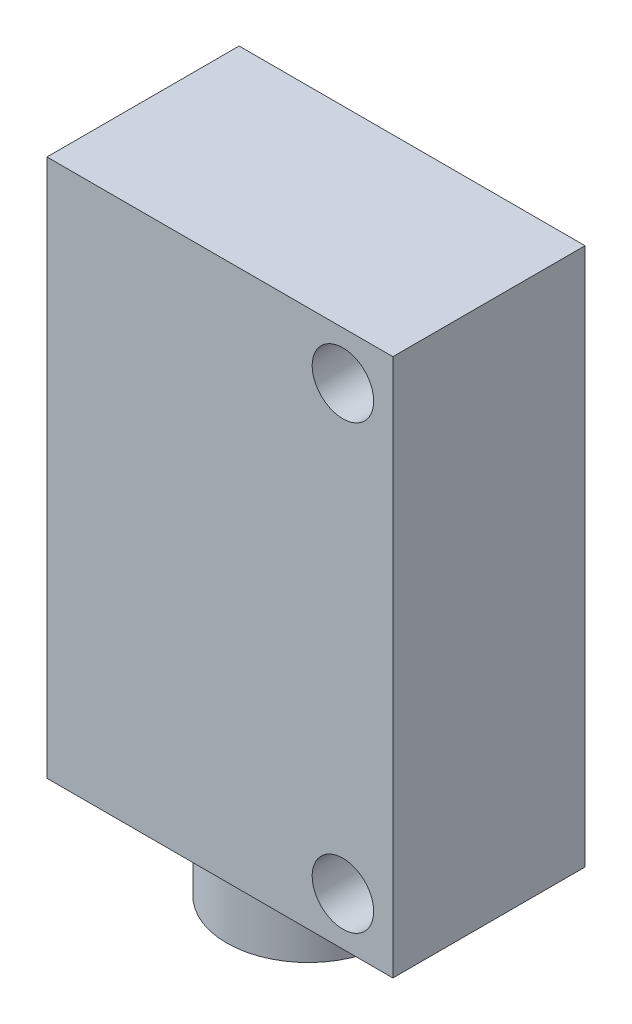
ISO-10303-21;
HEADER;
FILE_DESCRIPTION(('STEP AP214'),'2;1');
FILE_NAME('part.step','',(''),(''),'','','');
FILE_SCHEMA(('AUTOMOTIVE_DESIGN { 1 0 10303 214 1 1 1 1 }'));
ENDSEC;
DATA;
#1=APPLICATION_CONTEXT('core data for automotive mechanical design processes');
#2=APPLICATION_PROTOCOL_DEFINITION('international standard','automotive_design',2000,#1);
#3=PRODUCT_CONTEXT('',#1,'mechanical');
#4=PRODUCT('Part','Part','',(#3));
#5=PRODUCT_RELATED_PRODUCT_CATEGORY('part','',(#4));
#6=PRODUCT_DEFINITION_FORMATION('','',#4);
#7=PRODUCT_DEFINITION_CONTEXT('part definition',#1,'design');
#8=PRODUCT_DEFINITION('design','',#6,#7);
#9=PRODUCT_DEFINITION_SHAPE('','',#8);
#10=(LENGTH_UNIT() NAMED_UNIT(*) SI_UNIT(.MILLI.,.METRE.));
#11=(NAMED_UNIT(*) PLANE_ANGLE_UNIT() SI_UNIT($,.RADIAN.));
#12=(NAMED_UNIT(*) SI_UNIT($,.STERADIAN.) SOLID_ANGLE_UNIT());
#13=UNCERTAINTY_MEASURE_WITH_UNIT(LENGTH_MEASURE(1.E-05),#10,'distance_accuracy_value','');
#14=(GEOMETRIC_REPRESENTATION_CONTEXT(3) GLOBAL_UNCERTAINTY_ASSIGNED_CONTEXT((#13)) GLOBAL_UNIT_ASSIGNED_CONTEXT((#10,
#11,#12)) REPRESENTATION_CONTEXT('',''));
#15=CARTESIAN_POINT('',(0.,0.,0.));
#16=DIRECTION('',(0.,0.,1.));
#17=DIRECTION('',(1.,0.,0.));
#18=AXIS2_PLACEMENT_3D('',#15,#16,#17);
#19=CARTESIAN_POINT('',(0.,0.,10.));
#20=DIRECTION('',(1.,0.,0.));
#21=DIRECTION('',(0.,0.,-1.));
#22=AXIS2_PLACEMENT_3D('',#19,#20,#21);
#23=PLANE('',#22);
#24=DIRECTION('',(0.,-1.,0.));
#25=VECTOR('',#24,1.);
#26=CARTESIAN_POINT('',(0.,0.,0.));
#27=LINE('',#26,#25);
#28=CARTESIAN_POINT('',(0.,28.,0.));
#29=VERTEX_POINT('',#28);
#30=CARTESIAN_POINT('',(0.,0.,0.));
#31=VERTEX_POINT('',#30);
#32=EDGE_CURVE('E138',#29,#31,#27,.T.);
#33=ORIENTED_EDGE('',*,*,#32,.T.);
#34=DIRECTION('',(0.,0.,-1.));
#35=VECTOR('',#34,1.);
#36=CARTESIAN_POINT('',(0.,0.,10.));
#37=LINE('',#36,#35);
#38=CARTESIAN_POINT('',(0.,0.,10.));
#39=VERTEX_POINT('',#38);
#40=EDGE_CURVE('E40',#39,#31,#37,.T.);
#41=ORIENTED_EDGE('',*,*,#40,.F.);
#42=DIRECTION('',(0.,-1.,0.));
#43=VECTOR('',#42,1.);
#44=CARTESIAN_POINT('',(0.,0.,10.));
#45=LINE('',#44,#43);
#46=CARTESIAN_POINT('',(0.,28.,10.));
#47=VERTEX_POINT('',#46);
#48=EDGE_CURVE('E139',#47,#39,#45,.T.);
#49=ORIENTED_EDGE('',*,*,#48,.F.);
#50=DIRECTION('',(0.,0.,-1.));
#51=VECTOR('',#50,1.);
#52=CARTESIAN_POINT('',(0.,28.,10.));
#53=LINE('',#52,#51);
#54=EDGE_CURVE('E149',#47,#29,#53,.T.);
#55=ORIENTED_EDGE('',*,*,#54,.T.);
#56=EDGE_LOOP('',(#33,#41,#49,#55));
#57=FACE_BOUND('',#56,.T.);
#58=DIRECTION('',(0.,-1.,0.));
#59=VECTOR('',#58,1.);
#60=CARTESIAN_POINT('',(0.,25.6158389563872,1.73691712603841));
#61=LINE('',#60,#59);
#62=CARTESIAN_POINT('',(0.,25.6158389563872,1.73691712603841));
#63=VERTEX_POINT('',#62);
#64=CARTESIAN_POINT('',(0.,2.12586743571919,1.73691712603841));
#65=VERTEX_POINT('',#64);
#66=EDGE_CURVE('E117',#63,#65,#61,.T.);
#67=ORIENTED_EDGE('',*,*,#66,.F.);
#68=DIRECTION('',(0.,0.,-1.));
#69=VECTOR('',#68,1.);
#70=CARTESIAN_POINT('',(0.,25.6158389563872,1.73691712603841));
#71=LINE('',#70,#69);
#72=CARTESIAN_POINT('',(0.,25.6158389563872,8.61928643638521));
#73=VERTEX_POINT('',#72);
#74=EDGE_CURVE('E114',#73,#63,#71,.T.);
#75=ORIENTED_EDGE('',*,*,#74,.F.);
#76=DIRECTION('',(0.,1.,0.));
#77=VECTOR('',#76,1.);
#78=CARTESIAN_POINT('',(0.,25.6158389563872,8.61928643638521));
#79=LINE('',#78,#77);
#80=CARTESIAN_POINT('',(0.,2.12586743571919,8.61928643638521));
#81=VERTEX_POINT('',#80);
#82=EDGE_CURVE('E52',#81,#73,#79,.T.);
#83=ORIENTED_EDGE('',*,*,#82,.F.);
#84=DIRECTION('',(0.,0.,1.));
#85=VECTOR('',#84,1.);
#86=CARTESIAN_POINT('',(0.,2.12586743571919,1.73691712603841));
#87=LINE('',#86,#85);
#88=EDGE_CURVE('E47',#65,#81,#87,.T.);
#89=ORIENTED_EDGE('',*,*,#88,.F.);
#90=EDGE_LOOP('',(#67,#75,#83,#89));
#91=FACE_BOUND('',#90,.T.);
#92=ADVANCED_FACE('F33',(#57,#91),#23,.F.);
#93=CARTESIAN_POINT('',(0.,0.,10.));
#94=DIRECTION('',(0.,1.,0.));
#95=DIRECTION('',(0.,0.,1.));
#96=AXIS2_PLACEMENT_3D('',#93,#94,#95);
#97=PLANE('',#96);
#98=CARTESIAN_POINT('',(8.6,0.,5.));
#99=DIRECTION('',(0.,1.,0.));
#100=DIRECTION('',(0.,0.,1.));
#101=AXIS2_PLACEMENT_3D('',#98,#99,#100);
#102=CIRCLE('',#101,4.25);
#103=CARTESIAN_POINT('',(8.6,0.,9.25));
#104=VERTEX_POINT('',#103);
#105=EDGE_CURVE('E11',#104,#104,#102,.F.);
#106=ORIENTED_EDGE('',*,*,#105,.F.);
#107=EDGE_LOOP('',(#106));
#108=FACE_BOUND('',#107,.T.);
#109=DIRECTION('',(1.,0.,0.));
#110=VECTOR('',#109,1.);
#111=CARTESIAN_POINT('',(0.,0.,0.));
#112=LINE('',#111,#110);
#113=CARTESIAN_POINT('',(18.,0.,0.));
#114=VERTEX_POINT('',#113);
#115=EDGE_CURVE('E152',#31,#114,#112,.T.);
#116=ORIENTED_EDGE('',*,*,#115,.T.);
#117=DIRECTION('',(0.,0.,-1.));
#118=VECTOR('',#117,1.);
#119=CARTESIAN_POINT('',(18.,0.,10.));
#120=LINE('',#119,#118);
#121=CARTESIAN_POINT('',(18.,0.,10.));
#122=VERTEX_POINT('',#121);
#123=EDGE_CURVE('E162',#122,#114,#120,.T.);
#124=ORIENTED_EDGE('',*,*,#123,.F.);
#125=DIRECTION('',(1.,0.,0.));
#126=VECTOR('',#125,1.);
#127=CARTESIAN_POINT('',(0.,0.,10.));
#128=LINE('',#127,#126);
#129=EDGE_CURVE('E142',#39,#122,#128,.T.);
#130=ORIENTED_EDGE('',*,*,#129,.F.);
#131=ORIENTED_EDGE('',*,*,#40,.T.);
#132=EDGE_LOOP('',(#116,#124,#130,#131));
#133=FACE_BOUND('',#132,.T.);
#134=ADVANCED_FACE('F167',(#108,#133),#97,.F.);
#135=CARTESIAN_POINT('',(18.,0.,10.));
#136=DIRECTION('',(-1.,0.,0.));
#137=DIRECTION('',(0.,0.,1.));
#138=AXIS2_PLACEMENT_3D('',#135,#136,#137);
#139=PLANE('',#138);
#140=DIRECTION('',(0.,1.,0.));
#141=VECTOR('',#140,1.);
#142=CARTESIAN_POINT('',(18.,0.,0.));
#143=LINE('',#142,#141);
#144=CARTESIAN_POINT('',(18.,28.,0.));
#145=VERTEX_POINT('',#144);
#146=EDGE_CURVE('E154',#114,#145,#143,.T.);
#147=ORIENTED_EDGE('',*,*,#146,.T.);
#148=DIRECTION('',(0.,0.,-1.));
#149=VECTOR('',#148,1.);
#150=CARTESIAN_POINT('',(18.,28.,10.));
#151=LINE('',#150,#149);
#152=CARTESIAN_POINT('',(18.,28.,10.));
#153=VERTEX_POINT('',#152);
#154=EDGE_CURVE('E159',#153,#145,#151,.T.);
#155=ORIENTED_EDGE('',*,*,#154,.F.);
#156=DIRECTION('',(0.,1.,0.));
#157=VECTOR('',#156,1.);
#158=CARTESIAN_POINT('',(18.,0.,10.));
#159=LINE('',#158,#157);
#160=EDGE_CURVE('E145',#122,#153,#159,.T.);
#161=ORIENTED_EDGE('',*,*,#160,.F.);
#162=ORIENTED_EDGE('',*,*,#123,.T.);
#163=EDGE_LOOP('',(#147,#155,#161,#162));
#164=FACE_BOUND('',#163,.T.);
#165=ADVANCED_FACE('F179',(#164),#139,.F.);
#166=CARTESIAN_POINT('',(0.,28.,10.));
#167=DIRECTION('',(0.,-1.,0.));
#168=DIRECTION('',(0.,0.,-1.));
#169=AXIS2_PLACEMENT_3D('',#166,#167,#168);
#170=PLANE('',#169);
#171=DIRECTION('',(-1.,0.,0.));
#172=VECTOR('',#171,1.);
#173=CARTESIAN_POINT('',(0.,28.,0.));
#174=LINE('',#173,#172);
#175=EDGE_CURVE('E143',#145,#29,#174,.T.);
#176=ORIENTED_EDGE('',*,*,#175,.T.);
#177=ORIENTED_EDGE('',*,*,#54,.F.);
#178=DIRECTION('',(-1.,0.,0.));
#179=VECTOR('',#178,1.);
#180=CARTESIAN_POINT('',(0.,28.,10.));
#181=LINE('',#180,#179);
#182=EDGE_CURVE('E147',#153,#47,#181,.T.);
#183=ORIENTED_EDGE('',*,*,#182,.F.);
#184=ORIENTED_EDGE('',*,*,#154,.T.);
#185=EDGE_LOOP('',(#176,#177,#183,#184));
#186=FACE_BOUND('',#185,.T.);
#187=ADVANCED_FACE('F183',(#186),#170,.F.);
#188=CARTESIAN_POINT('',(0.,0.,10.));
#189=DIRECTION('',(0.,0.,-1.));
#190=DIRECTION('',(-1.,0.,0.));
#191=AXIS2_PLACEMENT_3D('',#188,#189,#190);
#192=PLANE('',#191);
#193=CARTESIAN_POINT('',(15.4,2.5,10.));
#194=DIRECTION('',(0.,0.,-1.));
#195=DIRECTION('',(-1.,0.,0.));
#196=AXIS2_PLACEMENT_3D('',#193,#194,#195);
#197=CIRCLE('',#196,1.6);
#198=CARTESIAN_POINT('',(13.8,2.5,10.));
#199=VERTEX_POINT('',#198);
#200=EDGE_CURVE('E121',#199,#199,#197,.T.);
#201=ORIENTED_EDGE('',*,*,#200,.T.);
#202=EDGE_LOOP('',(#201));
#203=FACE_BOUND('',#202,.T.);
#204=CARTESIAN_POINT('',(15.4,25.5,10.));
#205=DIRECTION('',(0.,0.,-1.));
#206=DIRECTION('',(-1.,0.,0.));
#207=AXIS2_PLACEMENT_3D('',#204,#205,#206);
#208=CIRCLE('',#207,1.6);
#209=CARTESIAN_POINT('',(13.8,25.5,10.));
#210=VERTEX_POINT('',#209);
#211=EDGE_CURVE('E132',#210,#210,#208,.T.);
#212=ORIENTED_EDGE('',*,*,#211,.T.);
#213=EDGE_LOOP('',(#212));
#214=FACE_BOUND('',#213,.T.);
#215=ORIENTED_EDGE('',*,*,#48,.T.);
#216=ORIENTED_EDGE('',*,*,#129,.T.);
#217=ORIENTED_EDGE('',*,*,#160,.T.);
#218=ORIENTED_EDGE('',*,*,#182,.T.);
#219=EDGE_LOOP('',(#215,#216,#217,#218));
#220=FACE_BOUND('',#219,.T.);
#221=ADVANCED_FACE('F185',(#203,#214,#220),#192,.F.);
#222=CARTESIAN_POINT('',(0.,0.,0.));
#223=DIRECTION('',(0.,0.,-1.));
#224=DIRECTION('',(-1.,0.,0.));
#225=AXIS2_PLACEMENT_3D('',#222,#223,#224);
#226=PLANE('',#225);
#227=CARTESIAN_POINT('',(15.4,2.5,0.));
#228=DIRECTION('',(0.,0.,-1.));
#229=DIRECTION('',(-1.,0.,0.));
#230=AXIS2_PLACEMENT_3D('',#227,#228,#229);
#231=CIRCLE('',#230,1.6);
#232=CARTESIAN_POINT('',(13.8,2.5,0.));
#233=VERTEX_POINT('',#232);
#234=EDGE_CURVE('E118',#233,#233,#231,.T.);
#235=ORIENTED_EDGE('',*,*,#234,.F.);
#236=EDGE_LOOP('',(#235));
#237=FACE_BOUND('',#236,.T.);
#238=CARTESIAN_POINT('',(15.4,25.5,0.));
#239=DIRECTION('',(0.,0.,-1.));
#240=DIRECTION('',(-1.,0.,0.));
#241=AXIS2_PLACEMENT_3D('',#238,#239,#240);
#242=CIRCLE('',#241,1.6);
#243=CARTESIAN_POINT('',(13.8,25.5,0.));
#244=VERTEX_POINT('',#243);
#245=EDGE_CURVE('E129',#244,#244,#242,.T.);
#246=ORIENTED_EDGE('',*,*,#245,.F.);
#247=EDGE_LOOP('',(#246));
#248=FACE_BOUND('',#247,.T.);
#249=ORIENTED_EDGE('',*,*,#32,.F.);
#250=ORIENTED_EDGE('',*,*,#175,.F.);
#251=ORIENTED_EDGE('',*,*,#146,.F.);
#252=ORIENTED_EDGE('',*,*,#115,.F.);
#253=EDGE_LOOP('',(#249,#250,#251,#252));
#254=FACE_BOUND('',#253,.T.);
#255=ADVANCED_FACE('F175',(#237,#248,#254),#226,.T.);
#256=CARTESIAN_POINT('',(8.6,-3.5,5.));
#257=DIRECTION('',(0.,1.,0.));
#258=DIRECTION('',(0.,0.,1.));
#259=AXIS2_PLACEMENT_3D('',#256,#257,#258);
#260=CYLINDRICAL_SURFACE('',#259,4.25);
#261=CARTESIAN_POINT('',(8.6,-3.5,5.));
#262=DIRECTION('',(0.,-1.,0.));
#263=DIRECTION('',(0.,0.,-1.));
#264=AXIS2_PLACEMENT_3D('',#261,#262,#263);
#265=CIRCLE('',#264,4.25);
#266=CARTESIAN_POINT('',(8.6,-3.5,0.75));
#267=VERTEX_POINT('',#266);
#268=EDGE_CURVE('E135',#267,#267,#265,.T.);
#269=ORIENTED_EDGE('',*,*,#268,.F.);
#270=EDGE_LOOP('',(#269));
#271=FACE_BOUND('',#270,.T.);
#272=ORIENTED_EDGE('',*,*,#105,.T.);
#273=EDGE_LOOP('',(#272));
#274=FACE_BOUND('',#273,.T.);
#275=ADVANCED_FACE('F193',(#271,#274),#260,.T.);
#276=CARTESIAN_POINT('',(8.6,-3.5,5.));
#277=DIRECTION('',(0.,-1.,0.));
#278=DIRECTION('',(0.,0.,-1.));
#279=AXIS2_PLACEMENT_3D('',#276,#277,#278);
#280=PLANE('',#279);
#281=ORIENTED_EDGE('',*,*,#268,.T.);
#282=EDGE_LOOP('',(#281));
#283=FACE_BOUND('',#282,.T.);
#284=ADVANCED_FACE('F211',(#283),#280,.T.);
#285=CARTESIAN_POINT('',(15.4,25.5,10.2));
#286=DIRECTION('',(0.,0.,-1.));
#287=DIRECTION('',(-1.,0.,0.));
#288=AXIS2_PLACEMENT_3D('',#285,#286,#287);
#289=CYLINDRICAL_SURFACE('',#288,1.6);
#290=ORIENTED_EDGE('',*,*,#245,.T.);
#291=EDGE_LOOP('',(#290));
#292=FACE_BOUND('',#291,.T.);
#293=ORIENTED_EDGE('',*,*,#211,.F.);
#294=EDGE_LOOP('',(#293));
#295=FACE_BOUND('',#294,.T.);
#296=ADVANCED_FACE('F216',(#292,#295),#289,.F.);
#297=CARTESIAN_POINT('',(15.4,2.5,10.2));
#298=DIRECTION('',(0.,0.,-1.));
#299=DIRECTION('',(-1.,0.,0.));
#300=AXIS2_PLACEMENT_3D('',#297,#298,#299);
#301=CYLINDRICAL_SURFACE('',#300,1.6);
#302=ORIENTED_EDGE('',*,*,#234,.T.);
#303=EDGE_LOOP('',(#302));
#304=FACE_BOUND('',#303,.T.);
#305=ORIENTED_EDGE('',*,*,#200,.F.);
#306=EDGE_LOOP('',(#305));
#307=FACE_BOUND('',#306,.T.);
#308=ADVANCED_FACE('F223',(#304,#307),#301,.F.);
#309=CARTESIAN_POINT('',(-1.,25.6158389563872,1.73691712603841));
#310=DIRECTION('',(0.,0.,1.));
#311=DIRECTION('',(1.,0.,0.));
#312=AXIS2_PLACEMENT_3D('',#309,#310,#311);
#313=PLANE('',#312);
#314=ORIENTED_EDGE('',*,*,#66,.T.);
#315=DIRECTION('',(1.,0.,0.));
#316=VECTOR('',#315,1.);
#317=CARTESIAN_POINT('',(-1.,2.12586743571919,1.73691712603841));
#318=LINE('',#317,#316);
#319=CARTESIAN_POINT('',(-1.,2.12586743571919,1.73691712603841));
#320=VERTEX_POINT('',#319);
#321=EDGE_CURVE('E98',#320,#65,#318,.T.);
#322=ORIENTED_EDGE('',*,*,#321,.F.);
#323=DIRECTION('',(0.,-1.,0.));
#324=VECTOR('',#323,1.);
#325=CARTESIAN_POINT('',(-1.,25.6158389563872,1.73691712603841));
#326=LINE('',#325,#324);
#327=CARTESIAN_POINT('',(-1.,25.6158389563872,1.73691712603841));
#328=VERTEX_POINT('',#327);
#329=EDGE_CURVE('E105',#328,#320,#326,.T.);
#330=ORIENTED_EDGE('',*,*,#329,.F.);
#331=DIRECTION('',(1.,0.,0.));
#332=VECTOR('',#331,1.);
#333=CARTESIAN_POINT('',(-1.,25.6158389563872,1.73691712603841));
#334=LINE('',#333,#332);
#335=EDGE_CURVE('E325',#328,#63,#334,.T.);
#336=ORIENTED_EDGE('',*,*,#335,.T.);
#337=EDGE_LOOP('',(#314,#322,#330,#336));
#338=FACE_BOUND('',#337,.T.);
#339=ADVANCED_FACE('F116',(#338),#313,.F.);
#340=CARTESIAN_POINT('',(-1.,2.12586743571919,1.73691712603841));
#341=DIRECTION('',(0.,1.,0.));
#342=DIRECTION('',(0.,0.,1.));
#343=AXIS2_PLACEMENT_3D('',#340,#341,#342);
#344=PLANE('',#343);
#345=ORIENTED_EDGE('',*,*,#88,.T.);
#346=DIRECTION('',(1.,0.,0.));
#347=VECTOR('',#346,1.);
#348=CARTESIAN_POINT('',(-1.,2.12586743571919,8.61928643638521));
#349=LINE('',#348,#347);
#350=CARTESIAN_POINT('',(-1.,2.12586743571919,8.61928643638521));
#351=VERTEX_POINT('',#350);
#352=EDGE_CURVE('E101',#351,#81,#349,.T.);
#353=ORIENTED_EDGE('',*,*,#352,.F.);
#354=DIRECTION('',(0.,0.,1.));
#355=VECTOR('',#354,1.);
#356=CARTESIAN_POINT('',(-1.,2.12586743571919,1.73691712603841));
#357=LINE('',#356,#355);
#358=EDGE_CURVE('E94',#320,#351,#357,.T.);
#359=ORIENTED_EDGE('',*,*,#358,.F.);
#360=ORIENTED_EDGE('',*,*,#321,.T.);
#361=EDGE_LOOP('',(#345,#353,#359,#360));
#362=FACE_BOUND('',#361,.T.);
#363=ADVANCED_FACE('F96',(#362),#344,.F.);
#364=CARTESIAN_POINT('',(-1.,25.6158389563872,8.61928643638521));
#365=DIRECTION('',(0.,0.,-1.));
#366=DIRECTION('',(-1.,0.,0.));
#367=AXIS2_PLACEMENT_3D('',#364,#365,#366);
#368=PLANE('',#367);
#369=ORIENTED_EDGE('',*,*,#82,.T.);
#370=DIRECTION('',(1.,0.,0.));
#371=VECTOR('',#370,1.);
#372=CARTESIAN_POINT('',(-1.,25.6158389563872,8.61928643638521));
#373=LINE('',#372,#371);
#374=CARTESIAN_POINT('',(-1.,25.6158389563872,8.61928643638521));
#375=VERTEX_POINT('',#374);
#376=EDGE_CURVE('E123',#375,#73,#373,.T.);
#377=ORIENTED_EDGE('',*,*,#376,.F.);
#378=DIRECTION('',(0.,1.,0.));
#379=VECTOR('',#378,1.);
#380=CARTESIAN_POINT('',(-1.,25.6158389563872,8.61928643638521));
#381=LINE('',#380,#379);
#382=EDGE_CURVE('E104',#351,#375,#381,.T.);
#383=ORIENTED_EDGE('',*,*,#382,.F.);
#384=ORIENTED_EDGE('',*,*,#352,.T.);
#385=EDGE_LOOP('',(#369,#377,#383,#384));
#386=FACE_BOUND('',#385,.T.);
#387=ADVANCED_FACE('F232',(#386),#368,.F.);
#388=CARTESIAN_POINT('',(-1.,25.6158389563872,1.73691712603841));
#389=DIRECTION('',(0.,-1.,0.));
#390=DIRECTION('',(0.,0.,-1.));
#391=AXIS2_PLACEMENT_3D('',#388,#389,#390);
#392=PLANE('',#391);
#393=ORIENTED_EDGE('',*,*,#74,.T.);
#394=ORIENTED_EDGE('',*,*,#335,.F.);
#395=DIRECTION('',(0.,0.,-1.));
#396=VECTOR('',#395,1.);
#397=CARTESIAN_POINT('',(-1.,25.6158389563872,1.73691712603841));
#398=LINE('',#397,#396);
#399=EDGE_CURVE('E110',#375,#328,#398,.T.);
#400=ORIENTED_EDGE('',*,*,#399,.F.);
#401=ORIENTED_EDGE('',*,*,#376,.T.);
#402=EDGE_LOOP('',(#393,#394,#400,#401));
#403=FACE_BOUND('',#402,.T.);
#404=ADVANCED_FACE('F235',(#403),#392,.F.);
#405=CARTESIAN_POINT('',(-1.,0.,0.));
#406=DIRECTION('',(-1.,0.,0.));
#407=DIRECTION('',(0.,0.,1.));
#408=AXIS2_PLACEMENT_3D('',#405,#406,#407);
#409=PLANE('',#408);
#410=ORIENTED_EDGE('',*,*,#329,.T.);
#411=ORIENTED_EDGE('',*,*,#358,.T.);
#412=ORIENTED_EDGE('',*,*,#382,.T.);
#413=ORIENTED_EDGE('',*,*,#399,.T.);
#414=EDGE_LOOP('',(#410,#411,#412,#413));
#415=FACE_BOUND('',#414,.T.);
#416=ADVANCED_FACE('F108',(#415),#409,.T.);
#417=CLOSED_SHELL('',(#92,#134,#165,#187,#221,#255,#275,#284,#296,#308,#339,#363,#387,#404,#416));
#418=MANIFOLD_SOLID_BREP('B2',#417);
#419=ADVANCED_BREP_SHAPE_REPRESENTATION('',(#18,#418),#14);
#420=SHAPE_DEFINITION_REPRESENTATION(#9,#419);
ENDSEC;
END-ISO-10303-21;
